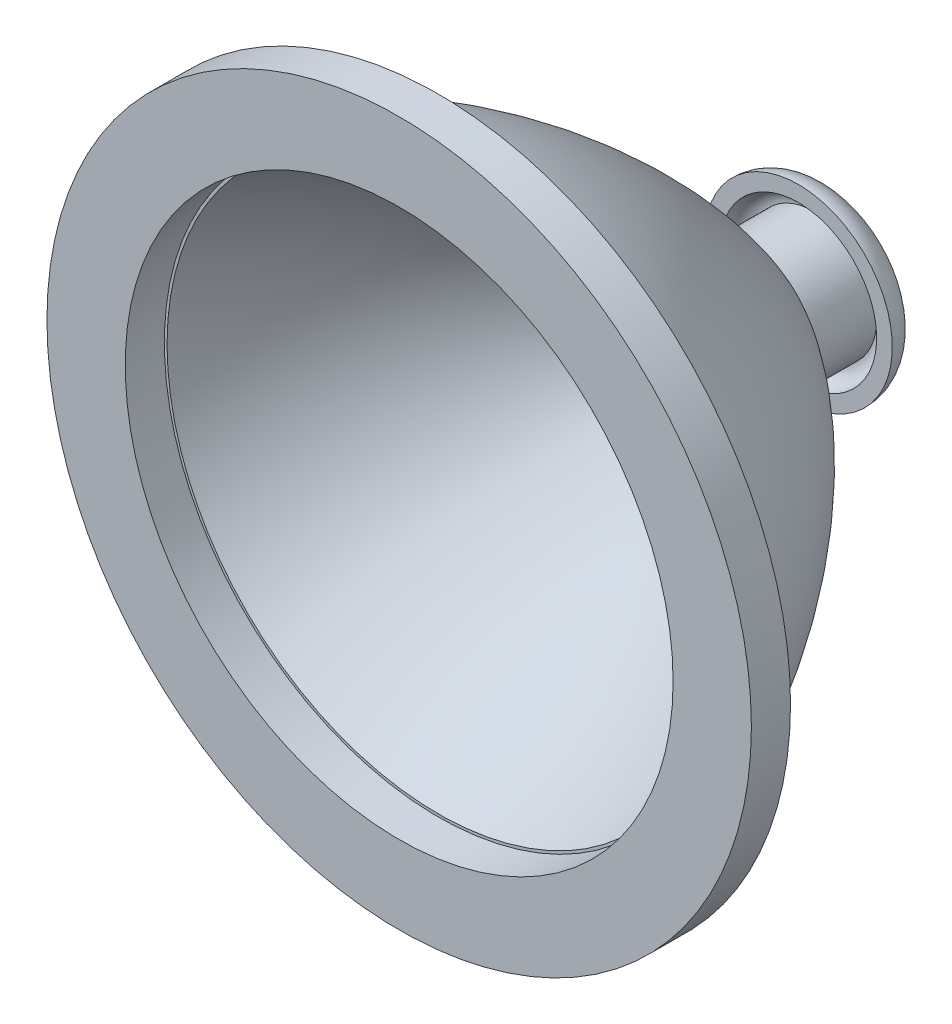
ISO-10303-21;
HEADER;
FILE_DESCRIPTION(('STEP AP214'),'2;1');
FILE_NAME('part.step','',(''),(''),'','','');
FILE_SCHEMA(('AUTOMOTIVE_DESIGN { 1 0 10303 214 1 1 1 1 }'));
ENDSEC;
DATA;
#1=APPLICATION_CONTEXT('core data for automotive mechanical design processes');
#2=APPLICATION_PROTOCOL_DEFINITION('international standard','automotive_design',2000,#1);
#3=PRODUCT_CONTEXT('',#1,'mechanical');
#4=PRODUCT('Part','Part','',(#3));
#5=PRODUCT_RELATED_PRODUCT_CATEGORY('part','',(#4));
#6=PRODUCT_DEFINITION_FORMATION('','',#4);
#7=PRODUCT_DEFINITION_CONTEXT('part definition',#1,'design');
#8=PRODUCT_DEFINITION('design','',#6,#7);
#9=PRODUCT_DEFINITION_SHAPE('','',#8);
#10=(LENGTH_UNIT() NAMED_UNIT(*) SI_UNIT(.MILLI.,.METRE.));
#11=(NAMED_UNIT(*) PLANE_ANGLE_UNIT() SI_UNIT($,.RADIAN.));
#12=(NAMED_UNIT(*) SI_UNIT($,.STERADIAN.) SOLID_ANGLE_UNIT());
#13=UNCERTAINTY_MEASURE_WITH_UNIT(LENGTH_MEASURE(1.E-05),#10,'distance_accuracy_value','');
#14=(GEOMETRIC_REPRESENTATION_CONTEXT(3) GLOBAL_UNCERTAINTY_ASSIGNED_CONTEXT((#13)) GLOBAL_UNIT_ASSIGNED_CONTEXT((#10,
#11,#12)) REPRESENTATION_CONTEXT('',''));
#15=CARTESIAN_POINT('',(0.,0.,0.));
#16=DIRECTION('',(0.,0.,1.));
#17=DIRECTION('',(1.,0.,0.));
#18=AXIS2_PLACEMENT_3D('',#15,#16,#17);
#19=CARTESIAN_POINT('',(0.,0.,-58.42));
#20=DIRECTION('',(0.,0.,-1.));
#21=DIRECTION('',(-1.,0.,0.));
#22=AXIS2_PLACEMENT_3D('',#19,#20,#21);
#23=TOROIDAL_SURFACE('',#22,10.16,5.08);
#24=CARTESIAN_POINT('',(0.,0.,-58.42));
#25=DIRECTION('',(0.,0.,-1.));
#26=DIRECTION('',(-1.,0.,0.));
#27=AXIS2_PLACEMENT_3D('',#24,#25,#26);
#28=CIRCLE('',#27,15.24);
#29=CARTESIAN_POINT('',(-15.24,0.,-58.42));
#30=VERTEX_POINT('',#29);
#31=EDGE_CURVE('E11',#30,#30,#28,.T.);
#32=ORIENTED_EDGE('',*,*,#31,.T.);
#33=EDGE_LOOP('',(#32));
#34=FACE_BOUND('',#33,.T.);
#35=CARTESIAN_POINT('',(0.,0.,-63.5));
#36=DIRECTION('',(0.,0.,-1.));
#37=DIRECTION('',(-1.,0.,0.));
#38=AXIS2_PLACEMENT_3D('',#35,#36,#37);
#39=CIRCLE('',#38,10.16);
#40=CARTESIAN_POINT('',(-10.16,0.,-63.5));
#41=VERTEX_POINT('',#40);
#42=EDGE_CURVE('E62',#41,#41,#39,.T.);
#43=ORIENTED_EDGE('',*,*,#42,.F.);
#44=EDGE_LOOP('',(#43));
#45=FACE_BOUND('',#44,.T.);
#46=ADVANCED_FACE('F48',(#34,#45),#23,.T.);
#47=CARTESIAN_POINT('',(0.,12.7,-58.42));
#48=DIRECTION('',(0.,0.,-1.));
#49=DIRECTION('',(-1.,0.,0.));
#50=AXIS2_PLACEMENT_3D('',#47,#48,#49);
#51=PLANE('',#50);
#52=ORIENTED_EDGE('',*,*,#31,.F.);
#53=EDGE_LOOP('',(#52));
#54=FACE_BOUND('',#53,.T.);
#55=CARTESIAN_POINT('',(0.,0.,-58.42));
#56=DIRECTION('',(0.,0.,-1.));
#57=DIRECTION('',(-1.,0.,0.));
#58=AXIS2_PLACEMENT_3D('',#55,#56,#57);
#59=CIRCLE('',#58,12.7);
#60=CARTESIAN_POINT('',(-12.7,0.,-58.42));
#61=VERTEX_POINT('',#60);
#62=EDGE_CURVE('E54',#61,#61,#59,.T.);
#63=ORIENTED_EDGE('',*,*,#62,.T.);
#64=EDGE_LOOP('',(#63));
#65=FACE_BOUND('',#64,.T.);
#66=ADVANCED_FACE('F71',(#54,#65),#51,.F.);
#67=CARTESIAN_POINT('',(0.,0.,-58.42));
#68=DIRECTION('',(0.,0.,-1.));
#69=DIRECTION('',(-1.,0.,0.));
#70=AXIS2_PLACEMENT_3D('',#67,#68,#69);
#71=TOROIDAL_SURFACE('',#70,10.16,2.54);
#72=ORIENTED_EDGE('',*,*,#62,.F.);
#73=EDGE_LOOP('',(#72));
#74=FACE_BOUND('',#73,.T.);
#75=CARTESIAN_POINT('',(0.,0.,-60.96));
#76=DIRECTION('',(0.,0.,-1.));
#77=DIRECTION('',(-1.,0.,0.));
#78=AXIS2_PLACEMENT_3D('',#75,#76,#77);
#79=CIRCLE('',#78,10.16);
#80=CARTESIAN_POINT('',(-10.16,0.,-60.96));
#81=VERTEX_POINT('',#80);
#82=EDGE_CURVE('E58',#81,#81,#79,.T.);
#83=ORIENTED_EDGE('',*,*,#82,.T.);
#84=EDGE_LOOP('',(#83));
#85=FACE_BOUND('',#84,.T.);
#86=ADVANCED_FACE('F75',(#74,#85),#71,.F.);
#87=CARTESIAN_POINT('',(0.,0.,-60.96));
#88=DIRECTION('',(0.,0.,-1.));
#89=DIRECTION('',(-1.,0.,0.));
#90=AXIS2_PLACEMENT_3D('',#87,#88,#89);
#91=CYLINDRICAL_SURFACE('',#90,10.16);
#92=ORIENTED_EDGE('',*,*,#82,.F.);
#93=EDGE_LOOP('',(#92));
#94=FACE_BOUND('',#93,.T.);
#95=ORIENTED_EDGE('',*,*,#42,.T.);
#96=EDGE_LOOP('',(#95));
#97=FACE_BOUND('',#96,.T.);
#98=ADVANCED_FACE('F68',(#94,#97),#91,.F.);
#99=CLOSED_SHELL('',(#46,#66,#86,#98));
#100=MANIFOLD_SOLID_BREP('B2',#99);
#101=CARTESIAN_POINT('',(0.,0.,0.));
#102=DIRECTION('',(0.,0.,-1.));
#103=DIRECTION('',(-1.,0.,0.));
#104=AXIS2_PLACEMENT_3D('',#101,#102,#103);
#105=PLANE('',#104);
#106=CARTESIAN_POINT('',(0.,0.,0.));
#107=DIRECTION('',(0.,0.,-1.));
#108=DIRECTION('',(-1.,0.,0.));
#109=AXIS2_PLACEMENT_3D('',#106,#107,#108);
#110=CIRCLE('',#109,44.0129431509694);
#111=CARTESIAN_POINT('',(-44.0129431509694,0.,0.));
#112=VERTEX_POINT('',#111);
#113=EDGE_CURVE('E116',#112,#112,#110,.F.);
#114=ORIENTED_EDGE('',*,*,#113,.F.);
#115=EDGE_LOOP('',(#114));
#116=FACE_BOUND('',#115,.T.);
#117=CARTESIAN_POINT('',(0.,0.,0.));
#118=DIRECTION('',(0.,0.,1.));
#119=DIRECTION('',(1.,0.,0.));
#120=AXIS2_PLACEMENT_3D('',#117,#118,#119);
#121=CIRCLE('',#120,44.45);
#122=CARTESIAN_POINT('',(44.45,0.,0.));
#123=VERTEX_POINT('',#122);
#124=EDGE_CURVE('E151',#123,#123,#121,.T.);
#125=ORIENTED_EDGE('',*,*,#124,.T.);
#126=EDGE_LOOP('',(#125));
#127=FACE_BOUND('',#126,.T.);
#128=ADVANCED_FACE('F109',(#116,#127),#105,.F.);
#129=CARTESIAN_POINT('',(0.,0.,34.7283102836008));
#130=DIRECTION('',(0.,0.,1.));
#131=DIRECTION('',(1.,0.,0.));
#132=AXIS2_PLACEMENT_3D('',#129,#130,#131);
#133=DEGENERATE_TOROIDAL_SURFACE('',#132,44.680387854501,101.6,.F.);
#134=CARTESIAN_POINT('',(0.,0.,0.));
#135=DIRECTION('',(0.,0.,1.));
#136=DIRECTION('',(1.,0.,0.));
#137=AXIS2_PLACEMENT_3D('',#134,#135,#136);
#138=CIRCLE('',#137,50.8);
#139=CARTESIAN_POINT('',(50.8,0.,0.));
#140=VERTEX_POINT('',#139);
#141=EDGE_CURVE('E47',#140,#140,#138,.T.);
#142=ORIENTED_EDGE('',*,*,#141,.F.);
#143=EDGE_LOOP('',(#142));
#144=FACE_BOUND('',#143,.T.);
#145=CARTESIAN_POINT('',(0.,0.,-50.8));
#146=DIRECTION('',(0.,0.,-1.));
#147=DIRECTION('',(-1.,0.,0.));
#148=AXIS2_PLACEMENT_3D('',#145,#146,#147);
#149=CIRCLE('',#148,10.16);
#150=CARTESIAN_POINT('',(-10.16,0.,-50.8));
#151=VERTEX_POINT('',#150);
#152=EDGE_CURVE('E127',#151,#151,#149,.T.);
#153=ORIENTED_EDGE('',*,*,#152,.F.);
#154=EDGE_LOOP('',(#153));
#155=FACE_BOUND('',#154,.T.);
#156=ADVANCED_FACE('F111',(#144,#155),#133,.F.);
#157=CARTESIAN_POINT('',(0.,0.,34.7283102836008));
#158=DIRECTION('',(0.,0.,1.));
#159=DIRECTION('',(1.,0.,0.));
#160=AXIS2_PLACEMENT_3D('',#157,#158,#159);
#161=DEGENERATE_TOROIDAL_SURFACE('',#160,44.680387854501,95.25,.F.);
#162=ORIENTED_EDGE('',*,*,#113,.T.);
#163=EDGE_LOOP('',(#162));
#164=FACE_BOUND('',#163,.T.);
#165=CARTESIAN_POINT('',(0.,0.,-44.45));
#166=DIRECTION('',(0.,0.,1.));
#167=DIRECTION('',(1.,0.,0.));
#168=AXIS2_PLACEMENT_3D('',#165,#166,#167);
#169=CIRCLE('',#168,8.26635596071236);
#170=CARTESIAN_POINT('',(8.26635596071236,0.,-44.45));
#171=VERTEX_POINT('',#170);
#172=EDGE_CURVE('E120',#171,#171,#169,.T.);
#173=ORIENTED_EDGE('',*,*,#172,.F.);
#174=EDGE_LOOP('',(#173));
#175=FACE_BOUND('',#174,.T.);
#176=ADVANCED_FACE('F181',(#164,#175),#161,.T.);
#177=CARTESIAN_POINT('',(0.,0.,-44.45));
#178=DIRECTION('',(0.,0.,1.));
#179=DIRECTION('',(1.,0.,0.));
#180=AXIS2_PLACEMENT_3D('',#177,#178,#179);
#181=PLANE('',#180);
#182=CARTESIAN_POINT('',(0.152613178336237,0.0379440801302647,-44.45));
#183=DIRECTION('',(0.,0.,1.));
#184=DIRECTION('',(1.,0.,0.));
#185=AXIS2_PLACEMENT_3D('',#182,#183,#184);
#186=CIRCLE('',#185,7.61999999999999);
#187=CARTESIAN_POINT('',(7.77261317833623,0.0379440801302647,-44.45));
#188=VERTEX_POINT('',#187);
#189=EDGE_CURVE('E141',#188,#188,#186,.T.);
#190=ORIENTED_EDGE('',*,*,#189,.F.);
#191=EDGE_LOOP('',(#190));
#192=FACE_BOUND('',#191,.T.);
#193=ORIENTED_EDGE('',*,*,#172,.T.);
#194=EDGE_LOOP('',(#193));
#195=FACE_BOUND('',#194,.T.);
#196=ADVANCED_FACE('F185',(#192,#195),#181,.T.);
#197=CARTESIAN_POINT('',(0.,0.,-60.96));
#198=DIRECTION('',(0.,0.,1.));
#199=DIRECTION('',(1.,0.,0.));
#200=AXIS2_PLACEMENT_3D('',#197,#198,#199);
#201=CYLINDRICAL_SURFACE('',#200,10.16);
#202=CARTESIAN_POINT('',(0.,0.,-60.96));
#203=DIRECTION('',(0.,0.,-1.));
#204=DIRECTION('',(-1.,0.,0.));
#205=AXIS2_PLACEMENT_3D('',#202,#203,#204);
#206=CIRCLE('',#205,10.16);
#207=CARTESIAN_POINT('',(-10.16,0.,-60.96));
#208=VERTEX_POINT('',#207);
#209=EDGE_CURVE('E124',#208,#208,#206,.T.);
#210=ORIENTED_EDGE('',*,*,#209,.F.);
#211=EDGE_LOOP('',(#210));
#212=FACE_BOUND('',#211,.T.);
#213=ORIENTED_EDGE('',*,*,#152,.T.);
#214=EDGE_LOOP('',(#213));
#215=FACE_BOUND('',#214,.T.);
#216=ADVANCED_FACE('F188',(#212,#215),#201,.T.);
#217=CARTESIAN_POINT('',(0.,0.,-60.96));
#218=DIRECTION('',(0.,0.,-1.));
#219=DIRECTION('',(-1.,0.,0.));
#220=AXIS2_PLACEMENT_3D('',#217,#218,#219);
#221=PLANE('',#220);
#222=CARTESIAN_POINT('',(0.152613178336237,0.0379440801302647,-60.96));
#223=DIRECTION('',(0.,0.,1.));
#224=DIRECTION('',(1.,0.,0.));
#225=AXIS2_PLACEMENT_3D('',#222,#223,#224);
#226=CIRCLE('',#225,6.74624);
#227=CARTESIAN_POINT('',(6.89885317833623,0.0379440801302647,-60.96));
#228=VERTEX_POINT('',#227);
#229=EDGE_CURVE('E130',#228,#228,#226,.T.);
#230=ORIENTED_EDGE('',*,*,#229,.T.);
#231=EDGE_LOOP('',(#230));
#232=FACE_BOUND('',#231,.T.);
#233=ORIENTED_EDGE('',*,*,#209,.T.);
#234=EDGE_LOOP('',(#233));
#235=FACE_BOUND('',#234,.T.);
#236=ADVANCED_FACE('F194',(#232,#235),#221,.T.);
#237=CARTESIAN_POINT('',(0.152613178336237,0.0379440801302647,-44.45));
#238=DIRECTION('',(0.,0.,1.));
#239=DIRECTION('',(1.,0.,0.));
#240=AXIS2_PLACEMENT_3D('',#237,#238,#239);
#241=CYLINDRICAL_SURFACE('',#240,6.74624);
#242=ORIENTED_EDGE('',*,*,#229,.F.);
#243=EDGE_LOOP('',(#242));
#244=FACE_BOUND('',#243,.T.);
#245=CARTESIAN_POINT('',(0.152613178336237,0.0379440801302647,-49.53));
#246=DIRECTION('',(0.,0.,1.));
#247=DIRECTION('',(1.,0.,0.));
#248=AXIS2_PLACEMENT_3D('',#245,#246,#247);
#249=CIRCLE('',#248,6.74624);
#250=CARTESIAN_POINT('',(6.89885317833624,0.0379440801302647,-49.53));
#251=VERTEX_POINT('',#250);
#252=EDGE_CURVE('E135',#251,#251,#249,.T.);
#253=ORIENTED_EDGE('',*,*,#252,.T.);
#254=EDGE_LOOP('',(#253));
#255=FACE_BOUND('',#254,.T.);
#256=ADVANCED_FACE('F198',(#244,#255),#241,.F.);
#257=CARTESIAN_POINT('',(6.89885317833624,0.0379440801302647,-49.53));
#258=DIRECTION('',(0.,0.,-1.));
#259=DIRECTION('',(-1.,0.,0.));
#260=AXIS2_PLACEMENT_3D('',#257,#258,#259);
#261=PLANE('',#260);
#262=ORIENTED_EDGE('',*,*,#252,.F.);
#263=EDGE_LOOP('',(#262));
#264=FACE_BOUND('',#263,.T.);
#265=CARTESIAN_POINT('',(0.152613178336237,0.0379440801302647,-49.53));
#266=DIRECTION('',(0.,0.,1.));
#267=DIRECTION('',(1.,0.,0.));
#268=AXIS2_PLACEMENT_3D('',#265,#266,#267);
#269=CIRCLE('',#268,7.62);
#270=CARTESIAN_POINT('',(7.77261317833623,0.0379440801302647,-49.53));
#271=VERTEX_POINT('',#270);
#272=EDGE_CURVE('E138',#271,#271,#269,.T.);
#273=ORIENTED_EDGE('',*,*,#272,.T.);
#274=EDGE_LOOP('',(#273));
#275=FACE_BOUND('',#274,.T.);
#276=ADVANCED_FACE('F202',(#264,#275),#261,.F.);
#277=CARTESIAN_POINT('',(0.152613178336237,0.0379440801302647,-44.45));
#278=DIRECTION('',(0.,0.,1.));
#279=DIRECTION('',(1.,0.,0.));
#280=AXIS2_PLACEMENT_3D('',#277,#278,#279);
#281=CYLINDRICAL_SURFACE('',#280,7.61999999999999);
#282=ORIENTED_EDGE('',*,*,#272,.F.);
#283=EDGE_LOOP('',(#282));
#284=FACE_BOUND('',#283,.T.);
#285=ORIENTED_EDGE('',*,*,#189,.T.);
#286=EDGE_LOOP('',(#285));
#287=FACE_BOUND('',#286,.T.);
#288=ADVANCED_FACE('F172',(#284,#287),#281,.F.);
#289=CARTESIAN_POINT('',(0.,0.,0.));
#290=DIRECTION('',(0.,0.,1.));
#291=DIRECTION('',(1.,0.,0.));
#292=AXIS2_PLACEMENT_3D('',#289,#290,#291);
#293=PLANE('',#292);
#294=CARTESIAN_POINT('',(0.,0.,0.));
#295=DIRECTION('',(0.,0.,1.));
#296=DIRECTION('',(1.,0.,0.));
#297=AXIS2_PLACEMENT_3D('',#294,#295,#296);
#298=CIRCLE('',#297,57.15);
#299=CARTESIAN_POINT('',(57.15,0.,0.));
#300=VERTEX_POINT('',#299);
#301=EDGE_CURVE('E145',#300,#300,#298,.T.);
#302=ORIENTED_EDGE('',*,*,#301,.F.);
#303=EDGE_LOOP('',(#302));
#304=FACE_BOUND('',#303,.T.);
#305=ORIENTED_EDGE('',*,*,#141,.T.);
#306=EDGE_LOOP('',(#305));
#307=FACE_BOUND('',#306,.T.);
#308=ADVANCED_FACE('F163',(#304,#307),#293,.F.);
#309=CARTESIAN_POINT('',(0.,0.,6.35));
#310=DIRECTION('',(0.,0.,1.));
#311=DIRECTION('',(1.,0.,0.));
#312=AXIS2_PLACEMENT_3D('',#309,#310,#311);
#313=PLANE('',#312);
#314=CARTESIAN_POINT('',(0.,0.,6.35));
#315=DIRECTION('',(0.,0.,1.));
#316=DIRECTION('',(1.,0.,0.));
#317=AXIS2_PLACEMENT_3D('',#314,#315,#316);
#318=CIRCLE('',#317,57.15);
#319=CARTESIAN_POINT('',(57.15,0.,6.35));
#320=VERTEX_POINT('',#319);
#321=EDGE_CURVE('E144',#320,#320,#318,.T.);
#322=ORIENTED_EDGE('',*,*,#321,.T.);
#323=EDGE_LOOP('',(#322));
#324=FACE_BOUND('',#323,.T.);
#325=CARTESIAN_POINT('',(0.,0.,6.35));
#326=DIRECTION('',(0.,0.,1.));
#327=DIRECTION('',(1.,0.,0.));
#328=AXIS2_PLACEMENT_3D('',#325,#326,#327);
#329=CIRCLE('',#328,44.45);
#330=CARTESIAN_POINT('',(44.45,0.,6.35));
#331=VERTEX_POINT('',#330);
#332=EDGE_CURVE('E148',#331,#331,#329,.T.);
#333=ORIENTED_EDGE('',*,*,#332,.F.);
#334=EDGE_LOOP('',(#333));
#335=FACE_BOUND('',#334,.T.);
#336=ADVANCED_FACE('F160',(#324,#335),#313,.T.);
#337=CARTESIAN_POINT('',(0.,0.,6.35));
#338=DIRECTION('',(0.,0.,-1.));
#339=DIRECTION('',(-1.,0.,0.));
#340=AXIS2_PLACEMENT_3D('',#337,#338,#339);
#341=CYLINDRICAL_SURFACE('',#340,57.15);
#342=ORIENTED_EDGE('',*,*,#321,.F.);
#343=EDGE_LOOP('',(#342));
#344=FACE_BOUND('',#343,.T.);
#345=ORIENTED_EDGE('',*,*,#301,.T.);
#346=EDGE_LOOP('',(#345));
#347=FACE_BOUND('',#346,.T.);
#348=ADVANCED_FACE('F162',(#344,#347),#341,.T.);
#349=CARTESIAN_POINT('',(0.,0.,6.35));
#350=DIRECTION('',(0.,0.,-1.));
#351=DIRECTION('',(-1.,0.,0.));
#352=AXIS2_PLACEMENT_3D('',#349,#350,#351);
#353=CYLINDRICAL_SURFACE('',#352,44.45);
#354=ORIENTED_EDGE('',*,*,#332,.T.);
#355=EDGE_LOOP('',(#354));
#356=FACE_BOUND('',#355,.T.);
#357=ORIENTED_EDGE('',*,*,#124,.F.);
#358=EDGE_LOOP('',(#357));
#359=FACE_BOUND('',#358,.T.);
#360=ADVANCED_FACE('F157',(#356,#359),#353,.F.);
#361=CLOSED_SHELL('',(#128,#156,#176,#196,#216,#236,#256,#276,#288,#308,#336,#348,#360));
#362=MANIFOLD_SOLID_BREP('B6',#361);
#363=ADVANCED_BREP_SHAPE_REPRESENTATION('',(#18,#100,#362),#14);
#364=SHAPE_DEFINITION_REPRESENTATION(#9,#363);
ENDSEC;
END-ISO-10303-21;
